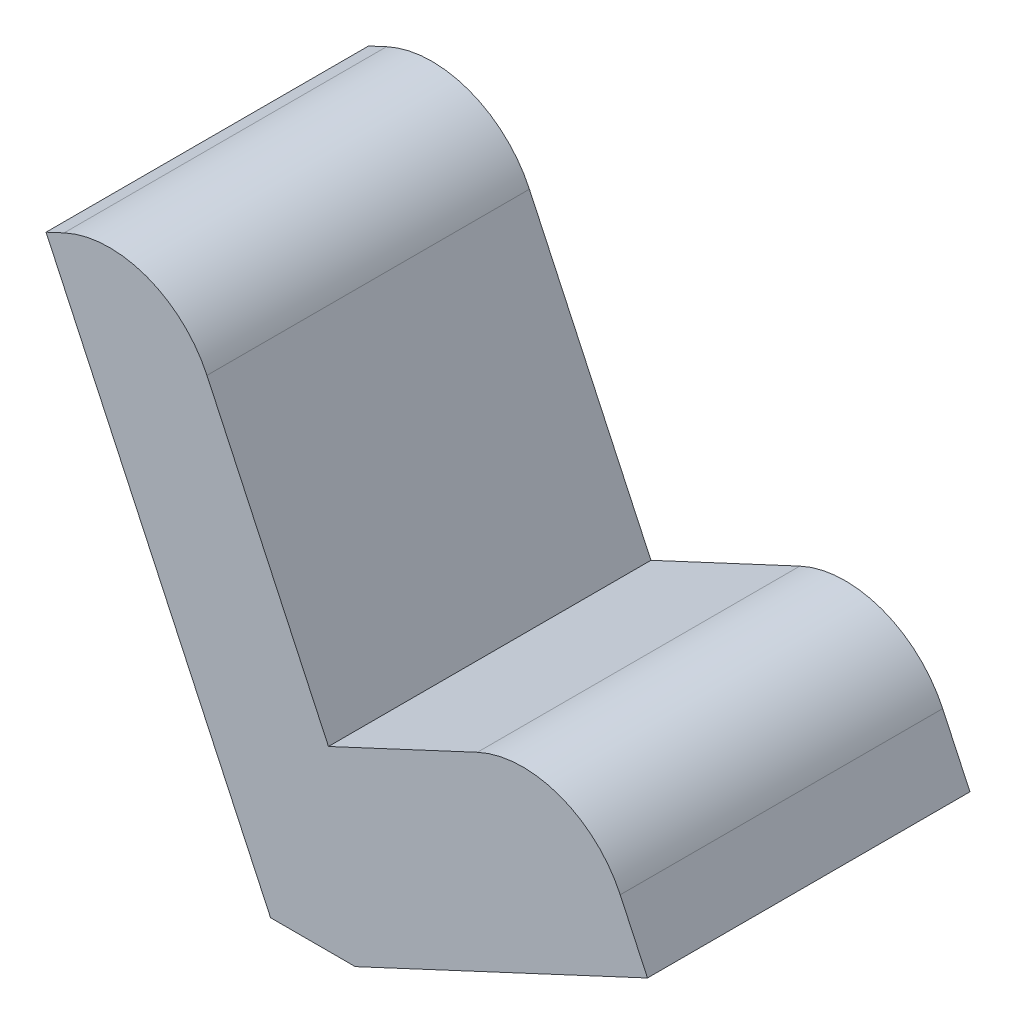
ISO-10303-21;
HEADER;
FILE_DESCRIPTION(('STEP AP214'),'2;1');
FILE_NAME('part.step','',(''),(''),'','','');
FILE_SCHEMA(('AUTOMOTIVE_DESIGN { 1 0 10303 214 1 1 1 1 }'));
ENDSEC;
DATA;
#1=APPLICATION_CONTEXT('core data for automotive mechanical design processes');
#2=APPLICATION_PROTOCOL_DEFINITION('international standard','automotive_design',2000,#1);
#3=PRODUCT_CONTEXT('',#1,'mechanical');
#4=PRODUCT('Part','Part','',(#3));
#5=PRODUCT_RELATED_PRODUCT_CATEGORY('part','',(#4));
#6=PRODUCT_DEFINITION_FORMATION('','',#4);
#7=PRODUCT_DEFINITION_CONTEXT('part definition',#1,'design');
#8=PRODUCT_DEFINITION('design','',#6,#7);
#9=PRODUCT_DEFINITION_SHAPE('','',#8);
#10=(LENGTH_UNIT() NAMED_UNIT(*) SI_UNIT(.MILLI.,.METRE.));
#11=(NAMED_UNIT(*) PLANE_ANGLE_UNIT() SI_UNIT($,.RADIAN.));
#12=(NAMED_UNIT(*) SI_UNIT($,.STERADIAN.) SOLID_ANGLE_UNIT());
#13=UNCERTAINTY_MEASURE_WITH_UNIT(LENGTH_MEASURE(1.E-05),#10,'distance_accuracy_value','');
#14=(GEOMETRIC_REPRESENTATION_CONTEXT(3) GLOBAL_UNCERTAINTY_ASSIGNED_CONTEXT((#13)) GLOBAL_UNIT_ASSIGNED_CONTEXT((#10,
#11,#12)) REPRESENTATION_CONTEXT('',''));
#15=CARTESIAN_POINT('',(0.,0.,0.));
#16=DIRECTION('',(0.,0.,1.));
#17=DIRECTION('',(1.,0.,0.));
#18=AXIS2_PLACEMENT_3D('',#15,#16,#17);
#19=CARTESIAN_POINT('',(12.1418569150795,36.513160355285,30.));
#20=DIRECTION('',(0.,0.,-1.));
#21=DIRECTION('',(-1.,0.,0.));
#22=AXIS2_PLACEMENT_3D('',#19,#20,#21);
#23=CYLINDRICAL_SURFACE('',#22,10.);
#24=CARTESIAN_POINT('',(12.1418569150795,36.513160355285,0.));
#25=DIRECTION('',(0.,0.,1.));
#26=DIRECTION('',(1.,0.,0.));
#27=AXIS2_PLACEMENT_3D('',#24,#25,#26);
#28=CIRCLE('',#27,10.);
#29=CARTESIAN_POINT('',(21.204934785446,40.739342972692,0.));
#30=VERTEX_POINT('',#29);
#31=CARTESIAN_POINT('',(7.91567429767239,45.5762382256515,0.));
#32=VERTEX_POINT('',#31);
#33=EDGE_CURVE('E135',#30,#32,#28,.T.);
#34=ORIENTED_EDGE('',*,*,#33,.T.);
#35=DIRECTION('',(0.,0.,-1.));
#36=VECTOR('',#35,1.);
#37=CARTESIAN_POINT('',(7.91567429767239,45.5762382256515,30.));
#38=LINE('',#37,#36);
#39=CARTESIAN_POINT('',(7.91567429767239,45.5762382256515,30.));
#40=VERTEX_POINT('',#39);
#41=EDGE_CURVE('E11',#40,#32,#38,.T.);
#42=ORIENTED_EDGE('',*,*,#41,.F.);
#43=CARTESIAN_POINT('',(12.1418569150795,36.513160355285,30.));
#44=DIRECTION('',(0.,0.,1.));
#45=DIRECTION('',(1.,0.,0.));
#46=AXIS2_PLACEMENT_3D('',#43,#44,#45);
#47=CIRCLE('',#46,10.);
#48=CARTESIAN_POINT('',(21.204934785446,40.739342972692,30.));
#49=VERTEX_POINT('',#48);
#50=EDGE_CURVE('E152',#49,#40,#47,.T.);
#51=ORIENTED_EDGE('',*,*,#50,.F.);
#52=DIRECTION('',(0.,0.,-1.));
#53=VECTOR('',#52,1.);
#54=CARTESIAN_POINT('',(21.204934785446,40.739342972692,30.));
#55=LINE('',#54,#53);
#56=EDGE_CURVE('E131',#49,#30,#55,.T.);
#57=ORIENTED_EDGE('',*,*,#56,.T.);
#58=EDGE_LOOP('',(#34,#42,#51,#57));
#59=FACE_BOUND('',#58,.T.);
#60=ADVANCED_FACE('F33',(#59),#23,.T.);
#61=CARTESIAN_POINT('',(7.91567429767239,45.5762382256515,30.));
#62=DIRECTION('',(0.422618261740702,-0.906307787036649,0.));
#63=DIRECTION('',(0.906307787036649,0.422618261740702,0.));
#64=AXIS2_PLACEMENT_3D('',#61,#62,#63);
#65=PLANE('',#64);
#66=DIRECTION('',(-0.906307787036649,-0.422618261740702,0.));
#67=VECTOR('',#66,1.);
#68=CARTESIAN_POINT('',(7.91567429767239,45.5762382256515,0.));
#69=LINE('',#68,#67);
#70=CARTESIAN_POINT('',(6.2360304236934,44.7930074242419,0.));
#71=VERTEX_POINT('',#70);
#72=EDGE_CURVE('E138',#32,#71,#69,.T.);
#73=ORIENTED_EDGE('',*,*,#72,.T.);
#74=DIRECTION('',(0.,0.,-1.));
#75=VECTOR('',#74,1.);
#76=CARTESIAN_POINT('',(6.2360304236934,44.7930074242419,30.));
#77=LINE('',#76,#75);
#78=CARTESIAN_POINT('',(6.2360304236934,44.7930074242419,30.));
#79=VERTEX_POINT('',#78);
#80=EDGE_CURVE('E41',#79,#71,#77,.T.);
#81=ORIENTED_EDGE('',*,*,#80,.F.);
#82=DIRECTION('',(-0.906307787036649,-0.422618261740702,0.));
#83=VECTOR('',#82,1.);
#84=CARTESIAN_POINT('',(7.91567429767239,45.5762382256515,30.));
#85=LINE('',#84,#83);
#86=EDGE_CURVE('E95',#40,#79,#85,.T.);
#87=ORIENTED_EDGE('',*,*,#86,.F.);
#88=ORIENTED_EDGE('',*,*,#41,.T.);
#89=EDGE_LOOP('',(#73,#81,#87,#88));
#90=FACE_BOUND('',#89,.T.);
#91=ADVANCED_FACE('F194',(#90),#65,.F.);
#92=CARTESIAN_POINT('',(6.2360304236934,44.7930074242419,30.));
#93=DIRECTION('',(0.906307787036649,0.422618261740701,0.));
#94=DIRECTION('',(-0.422618261740701,0.906307787036649,0.));
#95=AXIS2_PLACEMENT_3D('',#92,#93,#94);
#96=PLANE('',#95);
#97=DIRECTION('',(0.422618261740701,-0.906307787036649,0.));
#98=VECTOR('',#97,1.);
#99=CARTESIAN_POINT('',(6.2360304236934,44.7930074242419,0.));
#100=LINE('',#99,#98);
#101=CARTESIAN_POINT('',(27.1233528174112,0.,0.));
#102=VERTEX_POINT('',#101);
#103=EDGE_CURVE('E140',#71,#102,#100,.T.);
#104=ORIENTED_EDGE('',*,*,#103,.T.);
#105=DIRECTION('',(0.,0.,-1.));
#106=VECTOR('',#105,1.);
#107=CARTESIAN_POINT('',(27.1233528174112,0.,30.));
#108=LINE('',#107,#106);
#109=CARTESIAN_POINT('',(27.1233528174112,0.,30.));
#110=VERTEX_POINT('',#109);
#111=EDGE_CURVE('E162',#110,#102,#108,.T.);
#112=ORIENTED_EDGE('',*,*,#111,.F.);
#113=DIRECTION('',(0.422618261740701,-0.906307787036649,0.));
#114=VECTOR('',#113,1.);
#115=CARTESIAN_POINT('',(6.2360304236934,44.7930074242419,30.));
#116=LINE('',#115,#114);
#117=EDGE_CURVE('E170',#79,#110,#116,.T.);
#118=ORIENTED_EDGE('',*,*,#117,.F.);
#119=ORIENTED_EDGE('',*,*,#80,.T.);
#120=EDGE_LOOP('',(#104,#112,#118,#119));
#121=FACE_BOUND('',#120,.T.);
#122=ADVANCED_FACE('F168',(#121),#96,.F.);
#123=CARTESIAN_POINT('',(27.1233528174112,0.,30.));
#124=DIRECTION('',(0.,1.,0.));
#125=DIRECTION('',(-1.,0.,0.));
#126=AXIS2_PLACEMENT_3D('',#123,#124,#125);
#127=PLANE('',#126);
#128=DIRECTION('',(1.,0.,0.));
#129=VECTOR('',#128,1.);
#130=CARTESIAN_POINT('',(27.1233528174112,0.,0.));
#131=LINE('',#130,#129);
#132=CARTESIAN_POINT('',(35.,0.,0.));
#133=VERTEX_POINT('',#132);
#134=EDGE_CURVE('E142',#102,#133,#131,.T.);
#135=ORIENTED_EDGE('',*,*,#134,.T.);
#136=DIRECTION('',(0.,0.,-1.));
#137=VECTOR('',#136,1.);
#138=CARTESIAN_POINT('',(35.,0.,30.));
#139=LINE('',#138,#137);
#140=CARTESIAN_POINT('',(35.,0.,30.));
#141=VERTEX_POINT('',#140);
#142=EDGE_CURVE('E159',#141,#133,#139,.T.);
#143=ORIENTED_EDGE('',*,*,#142,.F.);
#144=DIRECTION('',(1.,0.,0.));
#145=VECTOR('',#144,1.);
#146=CARTESIAN_POINT('',(27.1233528174112,0.,30.));
#147=LINE('',#146,#145);
#148=EDGE_CURVE('E185',#110,#141,#147,.T.);
#149=ORIENTED_EDGE('',*,*,#148,.F.);
#150=ORIENTED_EDGE('',*,*,#111,.T.);
#151=EDGE_LOOP('',(#135,#143,#149,#150));
#152=FACE_BOUND('',#151,.T.);
#153=ADVANCED_FACE('F178',(#152),#127,.F.);
#154=CARTESIAN_POINT('',(35.,0.,30.));
#155=DIRECTION('',(-0.422618261740701,0.906307787036649,0.));
#156=DIRECTION('',(-0.906307787036649,-0.422618261740701,0.));
#157=AXIS2_PLACEMENT_3D('',#154,#155,#156);
#158=PLANE('',#157);
#159=DIRECTION('',(0.906307787036649,0.422618261740701,0.));
#160=VECTOR('',#159,1.);
#161=CARTESIAN_POINT('',(35.,0.,0.));
#162=LINE('',#161,#160);
#163=CARTESIAN_POINT('',(62.1892336110995,12.678547852221,0.));
#164=VERTEX_POINT('',#163);
#165=EDGE_CURVE('E144',#133,#164,#162,.T.);
#166=ORIENTED_EDGE('',*,*,#165,.T.);
#167=DIRECTION('',(0.,0.,-1.));
#168=VECTOR('',#167,1.);
#169=CARTESIAN_POINT('',(62.1892336110995,12.678547852221,30.));
#170=LINE('',#169,#168);
#171=CARTESIAN_POINT('',(62.1892336110995,12.678547852221,30.));
#172=VERTEX_POINT('',#171);
#173=EDGE_CURVE('E156',#172,#164,#170,.T.);
#174=ORIENTED_EDGE('',*,*,#173,.F.);
#175=DIRECTION('',(0.906307787036649,0.422618261740701,0.));
#176=VECTOR('',#175,1.);
#177=CARTESIAN_POINT('',(35.,0.,30.));
#178=LINE('',#177,#176);
#179=EDGE_CURVE('E184',#141,#172,#178,.T.);
#180=ORIENTED_EDGE('',*,*,#179,.F.);
#181=ORIENTED_EDGE('',*,*,#142,.T.);
#182=EDGE_LOOP('',(#166,#174,#180,#181));
#183=FACE_BOUND('',#182,.T.);
#184=ADVANCED_FACE('F182',(#183),#158,.F.);
#185=CARTESIAN_POINT('',(59.6535240406553,18.1163945744409,30.));
#186=DIRECTION('',(-0.906307787036649,-0.422618261740702,0.));
#187=DIRECTION('',(0.422618261740702,-0.906307787036649,0.));
#188=AXIS2_PLACEMENT_3D('',#185,#186,#187);
#189=PLANE('',#188);
#190=DIRECTION('',(-0.422618261740702,0.906307787036649,0.));
#191=VECTOR('',#190,1.);
#192=CARTESIAN_POINT('',(59.6535240406553,18.1163945744409,0.));
#193=LINE('',#192,#191);
#194=CARTESIAN_POINT('',(59.6535240406553,18.1163945744409,0.));
#195=VERTEX_POINT('',#194);
#196=EDGE_CURVE('E147',#164,#195,#193,.T.);
#197=ORIENTED_EDGE('',*,*,#196,.T.);
#198=DIRECTION('',(0.,0.,-1.));
#199=VECTOR('',#198,1.);
#200=CARTESIAN_POINT('',(59.6535240406553,18.1163945744409,30.));
#201=LINE('',#200,#199);
#202=CARTESIAN_POINT('',(59.6535240406553,18.1163945744409,30.));
#203=VERTEX_POINT('',#202);
#204=EDGE_CURVE('E126',#203,#195,#201,.T.);
#205=ORIENTED_EDGE('',*,*,#204,.F.);
#206=DIRECTION('',(-0.422618261740701,0.906307787036649,0.));
#207=VECTOR('',#206,1.);
#208=CARTESIAN_POINT('',(62.1892336110995,12.678547852221,30.));
#209=LINE('',#208,#207);
#210=EDGE_CURVE('E117',#172,#203,#209,.T.);
#211=ORIENTED_EDGE('',*,*,#210,.F.);
#212=ORIENTED_EDGE('',*,*,#173,.T.);
#213=EDGE_LOOP('',(#197,#205,#211,#212));
#214=FACE_BOUND('',#213,.T.);
#215=ADVANCED_FACE('F206',(#214),#189,.F.);
#216=CARTESIAN_POINT('',(50.5904461702888,13.8902119570339,30.));
#217=DIRECTION('',(0.,0.,-1.));
#218=DIRECTION('',(-1.,0.,0.));
#219=AXIS2_PLACEMENT_3D('',#216,#217,#218);
#220=CYLINDRICAL_SURFACE('',#219,10.);
#221=CARTESIAN_POINT('',(50.5904461702888,13.8902119570339,0.));
#222=DIRECTION('',(0.,0.,1.));
#223=DIRECTION('',(-1.,0.,0.));
#224=AXIS2_PLACEMENT_3D('',#221,#222,#223);
#225=CIRCLE('',#224,10.);
#226=CARTESIAN_POINT('',(46.3642635528817,22.9532898274004,0.));
#227=VERTEX_POINT('',#226);
#228=EDGE_CURVE('E125',#195,#227,#225,.T.);
#229=ORIENTED_EDGE('',*,*,#228,.T.);
#230=DIRECTION('',(0.,0.,-1.));
#231=VECTOR('',#230,1.);
#232=CARTESIAN_POINT('',(46.3642635528817,22.9532898274004,30.));
#233=LINE('',#232,#231);
#234=CARTESIAN_POINT('',(46.3642635528817,22.9532898274004,30.));
#235=VERTEX_POINT('',#234);
#236=EDGE_CURVE('E122',#235,#227,#233,.T.);
#237=ORIENTED_EDGE('',*,*,#236,.F.);
#238=CARTESIAN_POINT('',(50.5904461702888,13.8902119570339,30.));
#239=DIRECTION('',(0.,0.,1.));
#240=DIRECTION('',(-1.,0.,0.));
#241=AXIS2_PLACEMENT_3D('',#238,#239,#240);
#242=CIRCLE('',#241,10.);
#243=EDGE_CURVE('E111',#203,#235,#242,.T.);
#244=ORIENTED_EDGE('',*,*,#243,.F.);
#245=ORIENTED_EDGE('',*,*,#204,.T.);
#246=EDGE_LOOP('',(#229,#237,#244,#245));
#247=FACE_BOUND('',#246,.T.);
#248=ADVANCED_FACE('F123',(#247),#220,.T.);
#249=CARTESIAN_POINT('',(32.5110003577797,16.4934071090875,30.));
#250=DIRECTION('',(0.422618261740701,-0.906307787036649,0.));
#251=DIRECTION('',(0.906307787036649,0.422618261740701,0.));
#252=AXIS2_PLACEMENT_3D('',#249,#250,#251);
#253=PLANE('',#252);
#254=DIRECTION('',(-0.906307787036649,-0.422618261740701,0.));
#255=VECTOR('',#254,1.);
#256=CARTESIAN_POINT('',(32.5110003577797,16.4934071090875,0.));
#257=LINE('',#256,#255);
#258=CARTESIAN_POINT('',(32.5110003577797,16.4934071090875,0.));
#259=VERTEX_POINT('',#258);
#260=EDGE_CURVE('E81',#227,#259,#257,.T.);
#261=ORIENTED_EDGE('',*,*,#260,.T.);
#262=DIRECTION('',(0.,0.,-1.));
#263=VECTOR('',#262,1.);
#264=CARTESIAN_POINT('',(32.5110003577797,16.4934071090875,30.));
#265=LINE('',#264,#263);
#266=CARTESIAN_POINT('',(32.5110003577797,16.4934071090875,30.));
#267=VERTEX_POINT('',#266);
#268=EDGE_CURVE('E127',#267,#259,#265,.T.);
#269=ORIENTED_EDGE('',*,*,#268,.F.);
#270=DIRECTION('',(-0.906307787036649,-0.422618261740701,0.));
#271=VECTOR('',#270,1.);
#272=CARTESIAN_POINT('',(32.5110003577797,16.4934071090875,30.));
#273=LINE('',#272,#271);
#274=EDGE_CURVE('E115',#235,#267,#273,.T.);
#275=ORIENTED_EDGE('',*,*,#274,.F.);
#276=ORIENTED_EDGE('',*,*,#236,.T.);
#277=EDGE_LOOP('',(#261,#269,#275,#276));
#278=FACE_BOUND('',#277,.T.);
#279=ADVANCED_FACE('F129',(#278),#253,.F.);
#280=CARTESIAN_POINT('',(32.5110003577797,16.4934071090875,30.));
#281=DIRECTION('',(-0.906307787036649,-0.422618261740701,0.));
#282=DIRECTION('',(0.422618261740701,-0.906307787036649,0.));
#283=AXIS2_PLACEMENT_3D('',#280,#281,#282);
#284=PLANE('',#283);
#285=DIRECTION('',(-0.422618261740701,0.906307787036649,0.));
#286=VECTOR('',#285,1.);
#287=CARTESIAN_POINT('',(32.5110003577797,16.4934071090875,0.));
#288=LINE('',#287,#286);
#289=EDGE_CURVE('E87',#259,#30,#288,.T.);
#290=ORIENTED_EDGE('',*,*,#289,.T.);
#291=ORIENTED_EDGE('',*,*,#56,.F.);
#292=DIRECTION('',(-0.422618261740701,0.906307787036649,0.));
#293=VECTOR('',#292,1.);
#294=CARTESIAN_POINT('',(32.5110003577797,16.4934071090875,30.));
#295=LINE('',#294,#293);
#296=EDGE_CURVE('E49',#267,#49,#295,.T.);
#297=ORIENTED_EDGE('',*,*,#296,.F.);
#298=ORIENTED_EDGE('',*,*,#268,.T.);
#299=EDGE_LOOP('',(#290,#291,#297,#298));
#300=FACE_BOUND('',#299,.T.);
#301=ADVANCED_FACE('F214',(#300),#284,.F.);
#302=CARTESIAN_POINT('',(12.1418569150795,36.513160355285,30.));
#303=DIRECTION('',(0.,0.,1.));
#304=DIRECTION('',(1.,0.,0.));
#305=AXIS2_PLACEMENT_3D('',#302,#303,#304);
#306=PLANE('',#305);
#307=ORIENTED_EDGE('',*,*,#50,.T.);
#308=ORIENTED_EDGE('',*,*,#86,.T.);
#309=ORIENTED_EDGE('',*,*,#117,.T.);
#310=ORIENTED_EDGE('',*,*,#148,.T.);
#311=ORIENTED_EDGE('',*,*,#179,.T.);
#312=ORIENTED_EDGE('',*,*,#210,.T.);
#313=ORIENTED_EDGE('',*,*,#243,.T.);
#314=ORIENTED_EDGE('',*,*,#274,.T.);
#315=ORIENTED_EDGE('',*,*,#296,.T.);
#316=EDGE_LOOP('',(#307,#308,#309,#310,#311,#312,#313,#314,#315));
#317=FACE_BOUND('',#316,.T.);
#318=ADVANCED_FACE('F113',(#317),#306,.T.);
#319=CARTESIAN_POINT('',(12.1418569150795,36.513160355285,0.));
#320=DIRECTION('',(0.,0.,1.));
#321=DIRECTION('',(1.,0.,0.));
#322=AXIS2_PLACEMENT_3D('',#319,#320,#321);
#323=PLANE('',#322);
#324=ORIENTED_EDGE('',*,*,#33,.F.);
#325=ORIENTED_EDGE('',*,*,#289,.F.);
#326=ORIENTED_EDGE('',*,*,#260,.F.);
#327=ORIENTED_EDGE('',*,*,#228,.F.);
#328=ORIENTED_EDGE('',*,*,#196,.F.);
#329=ORIENTED_EDGE('',*,*,#165,.F.);
#330=ORIENTED_EDGE('',*,*,#134,.F.);
#331=ORIENTED_EDGE('',*,*,#103,.F.);
#332=ORIENTED_EDGE('',*,*,#72,.F.);
#333=EDGE_LOOP('',(#324,#325,#326,#327,#328,#329,#330,#331,#332));
#334=FACE_BOUND('',#333,.T.);
#335=ADVANCED_FACE('F174',(#334),#323,.F.);
#336=CLOSED_SHELL('',(#60,#91,#122,#153,#184,#215,#248,#279,#301,#318,#335));
#337=MANIFOLD_SOLID_BREP('B2',#336);
#338=ADVANCED_BREP_SHAPE_REPRESENTATION('',(#18,#337),#14);
#339=SHAPE_DEFINITION_REPRESENTATION(#9,#338);
ENDSEC;
END-ISO-10303-21;
